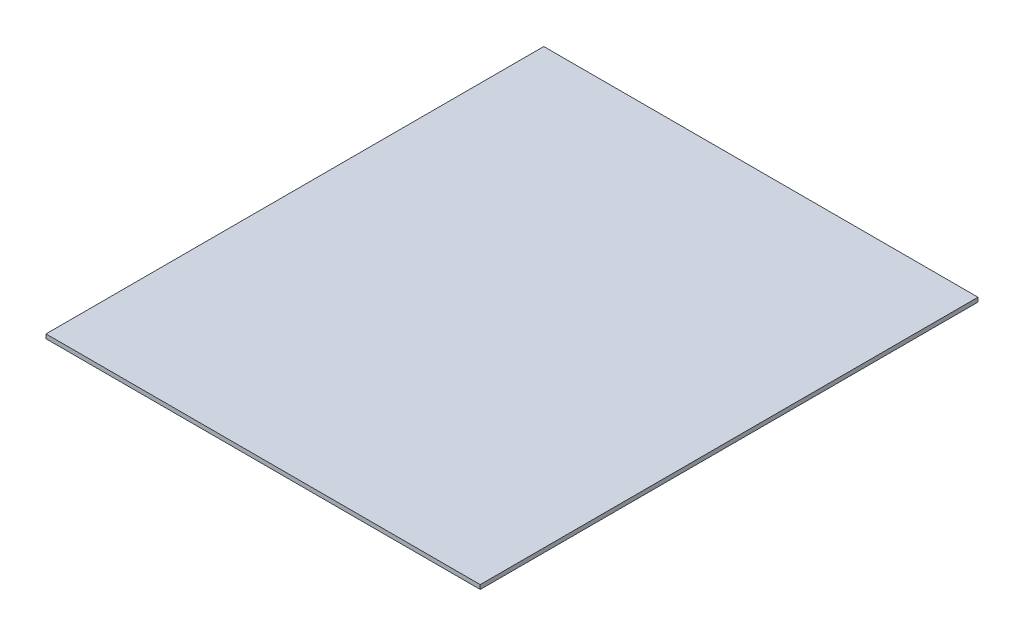
ISO-10303-21;
HEADER;
FILE_DESCRIPTION(('STEP AP214'),'2;1');
FILE_NAME('part.step','',(''),(''),'','','');
FILE_SCHEMA(('AUTOMOTIVE_DESIGN { 1 0 10303 214 1 1 1 1 }'));
ENDSEC;
DATA;
#1=APPLICATION_CONTEXT('core data for automotive mechanical design processes');
#2=APPLICATION_PROTOCOL_DEFINITION('international standard','automotive_design',2000,#1);
#3=PRODUCT_CONTEXT('',#1,'mechanical');
#4=PRODUCT('Part','Part','',(#3));
#5=PRODUCT_RELATED_PRODUCT_CATEGORY('part','',(#4));
#6=PRODUCT_DEFINITION_FORMATION('','',#4);
#7=PRODUCT_DEFINITION_CONTEXT('part definition',#1,'design');
#8=PRODUCT_DEFINITION('design','',#6,#7);
#9=PRODUCT_DEFINITION_SHAPE('','',#8);
#10=(LENGTH_UNIT() NAMED_UNIT(*) SI_UNIT(.MILLI.,.METRE.));
#11=(NAMED_UNIT(*) PLANE_ANGLE_UNIT() SI_UNIT($,.RADIAN.));
#12=(NAMED_UNIT(*) SI_UNIT($,.STERADIAN.) SOLID_ANGLE_UNIT());
#13=UNCERTAINTY_MEASURE_WITH_UNIT(LENGTH_MEASURE(1.E-05),#10,'distance_accuracy_value','');
#14=(GEOMETRIC_REPRESENTATION_CONTEXT(3) GLOBAL_UNCERTAINTY_ASSIGNED_CONTEXT((#13)) GLOBAL_UNIT_ASSIGNED_CONTEXT((#10,
#11,#12)) REPRESENTATION_CONTEXT('',''));
#15=CARTESIAN_POINT('',(0.,0.,0.));
#16=DIRECTION('',(0.,0.,1.));
#17=DIRECTION('',(1.,0.,0.));
#18=AXIS2_PLACEMENT_3D('',#15,#16,#17);
#19=CARTESIAN_POINT('',(205.,4.,-235.));
#20=DIRECTION('',(-1.,0.,0.));
#21=DIRECTION('',(0.,0.,1.));
#22=AXIS2_PLACEMENT_3D('',#19,#20,#21);
#23=PLANE('',#22);
#24=DIRECTION('',(0.,0.,-1.));
#25=VECTOR('',#24,1.);
#26=CARTESIAN_POINT('',(205.,0.,-235.));
#27=LINE('',#26,#25);
#28=CARTESIAN_POINT('',(205.,0.,235.));
#29=VERTEX_POINT('',#28);
#30=CARTESIAN_POINT('',(205.,0.,-235.));
#31=VERTEX_POINT('',#30);
#32=EDGE_CURVE('E101',#29,#31,#27,.T.);
#33=ORIENTED_EDGE('',*,*,#32,.T.);
#34=DIRECTION('',(0.,-1.,0.));
#35=VECTOR('',#34,1.);
#36=CARTESIAN_POINT('',(205.,4.,-235.));
#37=LINE('',#36,#35);
#38=CARTESIAN_POINT('',(205.,4.,-235.));
#39=VERTEX_POINT('',#38);
#40=EDGE_CURVE('E11',#39,#31,#37,.T.);
#41=ORIENTED_EDGE('',*,*,#40,.F.);
#42=DIRECTION('',(0.,0.,-1.));
#43=VECTOR('',#42,1.);
#44=CARTESIAN_POINT('',(205.,4.,-235.));
#45=LINE('',#44,#43);
#46=CARTESIAN_POINT('',(205.,4.,235.));
#47=VERTEX_POINT('',#46);
#48=EDGE_CURVE('E89',#47,#39,#45,.T.);
#49=ORIENTED_EDGE('',*,*,#48,.F.);
#50=DIRECTION('',(0.,-1.,0.));
#51=VECTOR('',#50,1.);
#52=CARTESIAN_POINT('',(205.,4.,235.));
#53=LINE('',#52,#51);
#54=EDGE_CURVE('E97',#47,#29,#53,.T.);
#55=ORIENTED_EDGE('',*,*,#54,.T.);
#56=EDGE_LOOP('',(#33,#41,#49,#55));
#57=FACE_BOUND('',#56,.T.);
#58=ADVANCED_FACE('F38',(#57),#23,.F.);
#59=CARTESIAN_POINT('',(-205.,4.,-235.));
#60=DIRECTION('',(0.,0.,1.));
#61=DIRECTION('',(1.,0.,0.));
#62=AXIS2_PLACEMENT_3D('',#59,#60,#61);
#63=PLANE('',#62);
#64=DIRECTION('',(-1.,0.,0.));
#65=VECTOR('',#64,1.);
#66=CARTESIAN_POINT('',(-205.,0.,-235.));
#67=LINE('',#66,#65);
#68=CARTESIAN_POINT('',(-205.,0.,-235.));
#69=VERTEX_POINT('',#68);
#70=EDGE_CURVE('E93',#31,#69,#67,.T.);
#71=ORIENTED_EDGE('',*,*,#70,.T.);
#72=DIRECTION('',(0.,-1.,0.));
#73=VECTOR('',#72,1.);
#74=CARTESIAN_POINT('',(-205.,4.,-235.));
#75=LINE('',#74,#73);
#76=CARTESIAN_POINT('',(-205.,4.,-235.));
#77=VERTEX_POINT('',#76);
#78=EDGE_CURVE('E46',#77,#69,#75,.T.);
#79=ORIENTED_EDGE('',*,*,#78,.F.);
#80=DIRECTION('',(-1.,0.,0.));
#81=VECTOR('',#80,1.);
#82=CARTESIAN_POINT('',(-205.,4.,-235.));
#83=LINE('',#82,#81);
#84=EDGE_CURVE('E84',#39,#77,#83,.T.);
#85=ORIENTED_EDGE('',*,*,#84,.F.);
#86=ORIENTED_EDGE('',*,*,#40,.T.);
#87=EDGE_LOOP('',(#71,#79,#85,#86));
#88=FACE_BOUND('',#87,.T.);
#89=ADVANCED_FACE('F92',(#88),#63,.F.);
#90=CARTESIAN_POINT('',(-205.,4.,-235.));
#91=DIRECTION('',(1.,0.,0.));
#92=DIRECTION('',(0.,0.,-1.));
#93=AXIS2_PLACEMENT_3D('',#90,#91,#92);
#94=PLANE('',#93);
#95=DIRECTION('',(0.,0.,1.));
#96=VECTOR('',#95,1.);
#97=CARTESIAN_POINT('',(-205.,0.,-235.));
#98=LINE('',#97,#96);
#99=CARTESIAN_POINT('',(-205.,0.,235.));
#100=VERTEX_POINT('',#99);
#101=EDGE_CURVE('E71',#69,#100,#98,.T.);
#102=ORIENTED_EDGE('',*,*,#101,.T.);
#103=DIRECTION('',(0.,-1.,0.));
#104=VECTOR('',#103,1.);
#105=CARTESIAN_POINT('',(-205.,4.,235.));
#106=LINE('',#105,#104);
#107=CARTESIAN_POINT('',(-205.,4.,235.));
#108=VERTEX_POINT('',#107);
#109=EDGE_CURVE('E94',#108,#100,#106,.T.);
#110=ORIENTED_EDGE('',*,*,#109,.F.);
#111=DIRECTION('',(0.,0.,1.));
#112=VECTOR('',#111,1.);
#113=CARTESIAN_POINT('',(-205.,4.,-235.));
#114=LINE('',#113,#112);
#115=EDGE_CURVE('E87',#77,#108,#114,.T.);
#116=ORIENTED_EDGE('',*,*,#115,.F.);
#117=ORIENTED_EDGE('',*,*,#78,.T.);
#118=EDGE_LOOP('',(#102,#110,#116,#117));
#119=FACE_BOUND('',#118,.T.);
#120=ADVANCED_FACE('F95',(#119),#94,.F.);
#121=CARTESIAN_POINT('',(-205.,4.,235.));
#122=DIRECTION('',(0.,0.,-1.));
#123=DIRECTION('',(-1.,0.,0.));
#124=AXIS2_PLACEMENT_3D('',#121,#122,#123);
#125=PLANE('',#124);
#126=DIRECTION('',(1.,0.,0.));
#127=VECTOR('',#126,1.);
#128=CARTESIAN_POINT('',(-205.,0.,235.));
#129=LINE('',#128,#127);
#130=EDGE_CURVE('E77',#100,#29,#129,.T.);
#131=ORIENTED_EDGE('',*,*,#130,.T.);
#132=ORIENTED_EDGE('',*,*,#54,.F.);
#133=DIRECTION('',(1.,0.,0.));
#134=VECTOR('',#133,1.);
#135=CARTESIAN_POINT('',(-205.,4.,235.));
#136=LINE('',#135,#134);
#137=EDGE_CURVE('E54',#108,#47,#136,.T.);
#138=ORIENTED_EDGE('',*,*,#137,.F.);
#139=ORIENTED_EDGE('',*,*,#109,.T.);
#140=EDGE_LOOP('',(#131,#132,#138,#139));
#141=FACE_BOUND('',#140,.T.);
#142=ADVANCED_FACE('F108',(#141),#125,.F.);
#143=CARTESIAN_POINT('',(0.,4.,0.));
#144=DIRECTION('',(0.,1.,0.));
#145=DIRECTION('',(0.,0.,1.));
#146=AXIS2_PLACEMENT_3D('',#143,#144,#145);
#147=PLANE('',#146);
#148=ORIENTED_EDGE('',*,*,#48,.T.);
#149=ORIENTED_EDGE('',*,*,#84,.T.);
#150=ORIENTED_EDGE('',*,*,#115,.T.);
#151=ORIENTED_EDGE('',*,*,#137,.T.);
#152=EDGE_LOOP('',(#148,#149,#150,#151));
#153=FACE_BOUND('',#152,.T.);
#154=ADVANCED_FACE('F85',(#153),#147,.T.);
#155=CARTESIAN_POINT('',(0.,0.,0.));
#156=DIRECTION('',(0.,1.,0.));
#157=DIRECTION('',(0.,0.,1.));
#158=AXIS2_PLACEMENT_3D('',#155,#156,#157);
#159=PLANE('',#158);
#160=ORIENTED_EDGE('',*,*,#32,.F.);
#161=ORIENTED_EDGE('',*,*,#130,.F.);
#162=ORIENTED_EDGE('',*,*,#101,.F.);
#163=ORIENTED_EDGE('',*,*,#70,.F.);
#164=EDGE_LOOP('',(#160,#161,#162,#163));
#165=FACE_BOUND('',#164,.T.);
#166=ADVANCED_FACE('F111',(#165),#159,.F.);
#167=CLOSED_SHELL('',(#58,#89,#120,#142,#154,#166));
#168=MANIFOLD_SOLID_BREP('B2',#167);
#169=ADVANCED_BREP_SHAPE_REPRESENTATION('',(#18,#168),#14);
#170=SHAPE_DEFINITION_REPRESENTATION(#9,#169);
ENDSEC;
END-ISO-10303-21;
